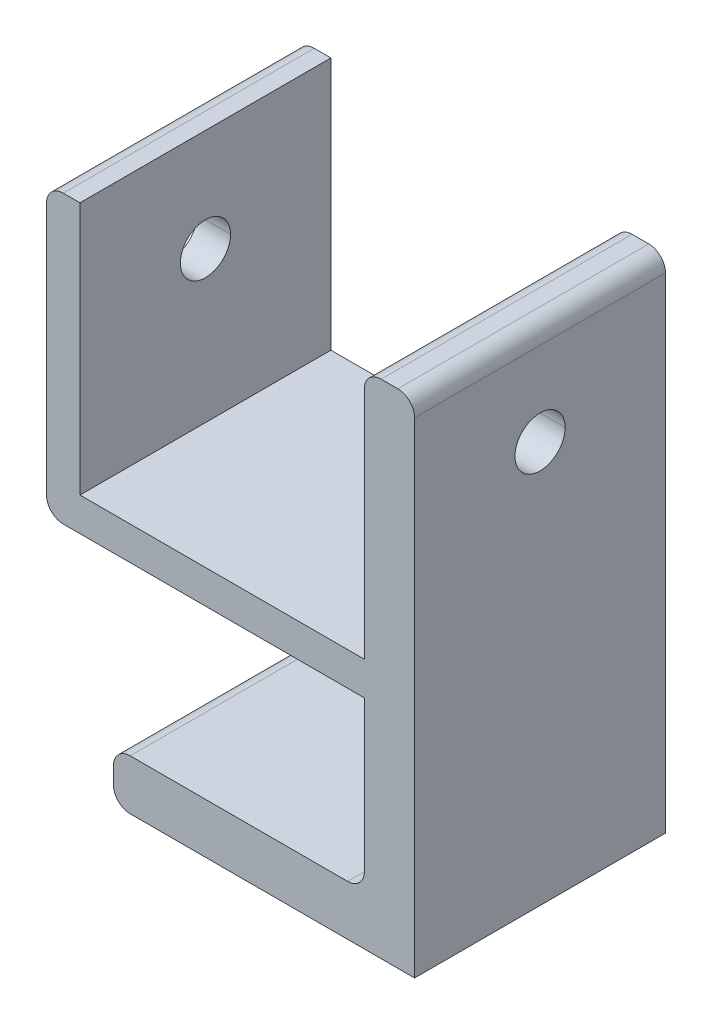
ISO-10303-21;
HEADER;
FILE_DESCRIPTION(('STEP AP214'),'2;1');
FILE_NAME('part.step','',(''),(''),'','','');
FILE_SCHEMA(('AUTOMOTIVE_DESIGN { 1 0 10303 214 1 1 1 1 }'));
ENDSEC;
DATA;
#1=APPLICATION_CONTEXT('core data for automotive mechanical design processes');
#2=APPLICATION_PROTOCOL_DEFINITION('international standard','automotive_design',2000,#1);
#3=PRODUCT_CONTEXT('',#1,'mechanical');
#4=PRODUCT('Part','Part','',(#3));
#5=PRODUCT_RELATED_PRODUCT_CATEGORY('part','',(#4));
#6=PRODUCT_DEFINITION_FORMATION('','',#4);
#7=PRODUCT_DEFINITION_CONTEXT('part definition',#1,'design');
#8=PRODUCT_DEFINITION('design','',#6,#7);
#9=PRODUCT_DEFINITION_SHAPE('','',#8);
#10=(LENGTH_UNIT() NAMED_UNIT(*) SI_UNIT(.MILLI.,.METRE.));
#11=(NAMED_UNIT(*) PLANE_ANGLE_UNIT() SI_UNIT($,.RADIAN.));
#12=(NAMED_UNIT(*) SI_UNIT($,.STERADIAN.) SOLID_ANGLE_UNIT());
#13=UNCERTAINTY_MEASURE_WITH_UNIT(LENGTH_MEASURE(1.E-05),#10,'distance_accuracy_value','');
#14=(GEOMETRIC_REPRESENTATION_CONTEXT(3) GLOBAL_UNCERTAINTY_ASSIGNED_CONTEXT((#13)) GLOBAL_UNIT_ASSIGNED_CONTEXT((#10,
#11,#12)) REPRESENTATION_CONTEXT('',''));
#15=CARTESIAN_POINT('',(0.,0.,0.));
#16=DIRECTION('',(0.,0.,1.));
#17=DIRECTION('',(1.,0.,0.));
#18=AXIS2_PLACEMENT_3D('',#15,#16,#17);
#19=CARTESIAN_POINT('',(-23.2426406871193,21.0015773299611,7.5));
#20=DIRECTION('',(1.,0.,0.));
#21=DIRECTION('',(0.,0.,-1.));
#22=AXIS2_PLACEMENT_3D('',#19,#20,#21);
#23=CYLINDRICAL_SURFACE('',#22,1.5);
#24=DIRECTION('',(1.,0.,0.));
#25=VECTOR('',#24,1.);
#26=CARTESIAN_POINT('',(-23.2426406871193,21.0015773299611,9.));
#27=LINE('',#26,#25);
#28=CARTESIAN_POINT('',(0.,21.0015773299611,9.));
#29=VERTEX_POINT('',#28);
#30=CARTESIAN_POINT('',(3.,21.0015773299611,9.));
#31=VERTEX_POINT('',#30);
#32=EDGE_CURVE('E410',#29,#31,#27,.T.);
#33=ORIENTED_EDGE('',*,*,#32,.F.);
#34=CARTESIAN_POINT('',(0.,21.0015773299611,7.5));
#35=DIRECTION('',(1.,0.,0.));
#36=DIRECTION('',(0.,1.,0.));
#37=AXIS2_PLACEMENT_3D('',#34,#35,#36);
#38=CIRCLE('',#37,1.5);
#39=CARTESIAN_POINT('',(0.,21.0015773299611,6.));
#40=VERTEX_POINT('',#39);
#41=EDGE_CURVE('E477',#40,#29,#38,.T.);
#42=ORIENTED_EDGE('',*,*,#41,.F.);
#43=DIRECTION('',(1.,0.,0.));
#44=VECTOR('',#43,1.);
#45=CARTESIAN_POINT('',(-23.2426406871193,21.0015773299611,6.));
#46=LINE('',#45,#44);
#47=CARTESIAN_POINT('',(3.,21.0015773299611,6.));
#48=VERTEX_POINT('',#47);
#49=EDGE_CURVE('E346',#40,#48,#46,.T.);
#50=ORIENTED_EDGE('',*,*,#49,.T.);
#51=CARTESIAN_POINT('',(3.,21.0015773299611,7.5));
#52=DIRECTION('',(1.,0.,0.));
#53=DIRECTION('',(0.,0.,-1.));
#54=AXIS2_PLACEMENT_3D('',#51,#52,#53);
#55=CIRCLE('',#54,1.5);
#56=EDGE_CURVE('E289',#48,#31,#55,.T.);
#57=ORIENTED_EDGE('',*,*,#56,.T.);
#58=EDGE_LOOP('',(#33,#42,#50,#57));
#59=FACE_BOUND('',#58,.T.);
#60=ADVANCED_FACE('F16',(#59),#23,.F.);
#61=CARTESIAN_POINT('',(-23.2426406871193,21.0015773299611,7.5));
#62=DIRECTION('',(1.,0.,0.));
#63=DIRECTION('',(0.,0.,-1.));
#64=AXIS2_PLACEMENT_3D('',#61,#62,#63);
#65=CYLINDRICAL_SURFACE('',#64,1.5);
#66=DIRECTION('',(1.,0.,0.));
#67=VECTOR('',#66,1.);
#68=CARTESIAN_POINT('',(-23.2426406871193,21.0015773299611,9.));
#69=LINE('',#68,#67);
#70=CARTESIAN_POINT('',(-19.,21.0015773299611,9.));
#71=VERTEX_POINT('',#70);
#72=CARTESIAN_POINT('',(-17.,21.0015773299611,9.));
#73=VERTEX_POINT('',#72);
#74=EDGE_CURVE('E330',#71,#73,#69,.T.);
#75=ORIENTED_EDGE('',*,*,#74,.F.);
#76=CARTESIAN_POINT('',(-19.,21.0015773299611,7.5));
#77=DIRECTION('',(-1.,0.,0.));
#78=DIRECTION('',(0.,0.,-1.));
#79=AXIS2_PLACEMENT_3D('',#76,#77,#78);
#80=CIRCLE('',#79,1.5);
#81=CARTESIAN_POINT('',(-19.,21.0015773299611,6.));
#82=VERTEX_POINT('',#81);
#83=EDGE_CURVE('E399',#71,#82,#80,.T.);
#84=ORIENTED_EDGE('',*,*,#83,.T.);
#85=DIRECTION('',(1.,0.,0.));
#86=VECTOR('',#85,1.);
#87=CARTESIAN_POINT('',(-23.2426406871193,21.0015773299611,6.));
#88=LINE('',#87,#86);
#89=CARTESIAN_POINT('',(-17.,21.0015773299611,6.));
#90=VERTEX_POINT('',#89);
#91=EDGE_CURVE('E329',#82,#90,#88,.T.);
#92=ORIENTED_EDGE('',*,*,#91,.T.);
#93=CARTESIAN_POINT('',(-17.,21.0015773299611,7.5));
#94=DIRECTION('',(-1.,0.,0.));
#95=DIRECTION('',(0.,0.,1.));
#96=AXIS2_PLACEMENT_3D('',#93,#94,#95);
#97=CIRCLE('',#96,1.5);
#98=EDGE_CURVE('E288',#73,#90,#97,.T.);
#99=ORIENTED_EDGE('',*,*,#98,.F.);
#100=EDGE_LOOP('',(#75,#84,#92,#99));
#101=FACE_BOUND('',#100,.T.);
#102=ADVANCED_FACE('F598',(#101),#65,.F.);
#103=CARTESIAN_POINT('',(-5.,27.1285759151948,7.5));
#104=DIRECTION('',(0.,-1.,0.));
#105=DIRECTION('',(1.,0.,0.));
#106=AXIS2_PLACEMENT_3D('',#103,#104,#105);
#107=CYLINDRICAL_SURFACE('',#106,1.5);
#108=DIRECTION('',(0.,-1.,0.));
#109=VECTOR('',#108,1.);
#110=CARTESIAN_POINT('',(-6.5,27.1285759151948,7.5));
#111=LINE('',#110,#109);
#112=CARTESIAN_POINT('',(-6.5,0.,7.5));
#113=VERTEX_POINT('',#112);
#114=CARTESIAN_POINT('',(-6.5,-3.,7.5));
#115=VERTEX_POINT('',#114);
#116=EDGE_CURVE('E340',#113,#115,#111,.T.);
#117=ORIENTED_EDGE('',*,*,#116,.F.);
#118=CARTESIAN_POINT('',(-5.,0.,7.5));
#119=DIRECTION('',(0.,1.,0.));
#120=DIRECTION('',(1.,0.,0.));
#121=AXIS2_PLACEMENT_3D('',#118,#119,#120);
#122=CIRCLE('',#121,1.5);
#123=CARTESIAN_POINT('',(-3.5,0.,7.5));
#124=VERTEX_POINT('',#123);
#125=EDGE_CURVE('E360',#113,#124,#122,.T.);
#126=ORIENTED_EDGE('',*,*,#125,.T.);
#127=DIRECTION('',(0.,-1.,0.));
#128=VECTOR('',#127,1.);
#129=CARTESIAN_POINT('',(-3.5,27.1285759151948,7.5));
#130=LINE('',#129,#128);
#131=CARTESIAN_POINT('',(-3.5,-3.,7.5));
#132=VERTEX_POINT('',#131);
#133=EDGE_CURVE('E317',#124,#132,#130,.T.);
#134=ORIENTED_EDGE('',*,*,#133,.T.);
#135=CARTESIAN_POINT('',(-5.,-3.,7.5));
#136=DIRECTION('',(0.,-1.,0.));
#137=DIRECTION('',(1.,0.,0.));
#138=AXIS2_PLACEMENT_3D('',#135,#136,#137);
#139=CIRCLE('',#138,1.5);
#140=EDGE_CURVE('E10',#132,#115,#139,.T.);
#141=ORIENTED_EDGE('',*,*,#140,.T.);
#142=EDGE_LOOP('',(#117,#126,#134,#141));
#143=FACE_BOUND('',#142,.T.);
#144=ADVANCED_FACE('F556',(#143),#107,.F.);
#145=CARTESIAN_POINT('',(2.,26.,0.));
#146=DIRECTION('',(0.,0.,1.));
#147=DIRECTION('',(1.,0.,0.));
#148=AXIS2_PLACEMENT_3D('',#145,#146,#147);
#149=PLANE('',#148);
#150=DIRECTION('',(0.,1.,0.));
#151=VECTOR('',#150,1.);
#152=CARTESIAN_POINT('',(3.,-3.,0.));
#153=LINE('',#152,#151);
#154=CARTESIAN_POINT('',(3.,-3.,0.));
#155=VERTEX_POINT('',#154);
#156=CARTESIAN_POINT('',(3.,26.,0.));
#157=VERTEX_POINT('',#156);
#158=EDGE_CURVE('E312',#155,#157,#153,.T.);
#159=ORIENTED_EDGE('',*,*,#158,.F.);
#160=DIRECTION('',(1.,0.,0.));
#161=VECTOR('',#160,1.);
#162=CARTESIAN_POINT('',(-14.,-3.,0.));
#163=LINE('',#162,#161);
#164=CARTESIAN_POINT('',(-14.,-3.,0.));
#165=VERTEX_POINT('',#164);
#166=EDGE_CURVE('E257',#165,#155,#163,.T.);
#167=ORIENTED_EDGE('',*,*,#166,.F.);
#168=CARTESIAN_POINT('',(-14.,-2.,0.));
#169=DIRECTION('',(0.,0.,1.));
#170=DIRECTION('',(-1.,0.,0.));
#171=AXIS2_PLACEMENT_3D('',#168,#169,#170);
#172=CIRCLE('',#171,1.);
#173=CARTESIAN_POINT('',(-15.,-2.,0.));
#174=VERTEX_POINT('',#173);
#175=EDGE_CURVE('E269',#174,#165,#172,.T.);
#176=ORIENTED_EDGE('',*,*,#175,.F.);
#177=DIRECTION('',(0.,-1.,0.));
#178=VECTOR('',#177,1.);
#179=CARTESIAN_POINT('',(-15.,-1.,0.));
#180=LINE('',#179,#178);
#181=CARTESIAN_POINT('',(-15.,-1.,0.));
#182=VERTEX_POINT('',#181);
#183=EDGE_CURVE('E272',#182,#174,#180,.T.);
#184=ORIENTED_EDGE('',*,*,#183,.F.);
#185=CARTESIAN_POINT('',(-14.,-1.,0.));
#186=DIRECTION('',(0.,0.,1.));
#187=DIRECTION('',(-1.,0.,0.));
#188=AXIS2_PLACEMENT_3D('',#185,#186,#187);
#189=CIRCLE('',#188,1.);
#190=CARTESIAN_POINT('',(-14.,0.,0.));
#191=VERTEX_POINT('',#190);
#192=EDGE_CURVE('E364',#191,#182,#189,.T.);
#193=ORIENTED_EDGE('',*,*,#192,.F.);
#194=DIRECTION('',(-1.,0.,0.));
#195=VECTOR('',#194,1.);
#196=CARTESIAN_POINT('',(-1.,0.,0.));
#197=LINE('',#196,#195);
#198=CARTESIAN_POINT('',(-1.,0.,0.));
#199=VERTEX_POINT('',#198);
#200=EDGE_CURVE('E339',#199,#191,#197,.T.);
#201=ORIENTED_EDGE('',*,*,#200,.F.);
#202=CARTESIAN_POINT('',(-1.,1.,0.));
#203=DIRECTION('',(0.,0.,-1.));
#204=DIRECTION('',(1.,0.,0.));
#205=AXIS2_PLACEMENT_3D('',#202,#203,#204);
#206=CIRCLE('',#205,1.);
#207=CARTESIAN_POINT('',(0.,1.,0.));
#208=VERTEX_POINT('',#207);
#209=EDGE_CURVE('E358',#208,#199,#206,.T.);
#210=ORIENTED_EDGE('',*,*,#209,.F.);
#211=DIRECTION('',(0.,-1.,0.));
#212=VECTOR('',#211,1.);
#213=CARTESIAN_POINT('',(0.,10.,0.));
#214=LINE('',#213,#212);
#215=CARTESIAN_POINT('',(0.,10.,0.));
#216=VERTEX_POINT('',#215);
#217=EDGE_CURVE('E386',#216,#208,#214,.T.);
#218=ORIENTED_EDGE('',*,*,#217,.F.);
#219=DIRECTION('',(1.,0.,0.));
#220=VECTOR('',#219,1.);
#221=CARTESIAN_POINT('',(-18.,10.,0.));
#222=LINE('',#221,#220);
#223=CARTESIAN_POINT('',(-18.,10.,0.));
#224=VERTEX_POINT('',#223);
#225=EDGE_CURVE('E401',#224,#216,#222,.T.);
#226=ORIENTED_EDGE('',*,*,#225,.F.);
#227=CARTESIAN_POINT('',(-18.,11.,0.));
#228=DIRECTION('',(0.,0.,1.));
#229=DIRECTION('',(-1.,0.,0.));
#230=AXIS2_PLACEMENT_3D('',#227,#228,#229);
#231=CIRCLE('',#230,1.);
#232=CARTESIAN_POINT('',(-19.,11.,0.));
#233=VERTEX_POINT('',#232);
#234=EDGE_CURVE('E415',#233,#224,#231,.T.);
#235=ORIENTED_EDGE('',*,*,#234,.F.);
#236=DIRECTION('',(0.,-1.,0.));
#237=VECTOR('',#236,1.);
#238=CARTESIAN_POINT('',(-19.,26.1275759151948,0.));
#239=LINE('',#238,#237);
#240=CARTESIAN_POINT('',(-19.,26.1275759151948,0.));
#241=VERTEX_POINT('',#240);
#242=EDGE_CURVE('E19',#241,#233,#239,.T.);
#243=ORIENTED_EDGE('',*,*,#242,.F.);
#244=CARTESIAN_POINT('',(-18.,26.1275759151948,0.));
#245=DIRECTION('',(0.,0.,1.));
#246=DIRECTION('',(-1.,0.,0.));
#247=AXIS2_PLACEMENT_3D('',#244,#245,#246);
#248=CIRCLE('',#247,1.);
#249=CARTESIAN_POINT('',(-18.,27.1275759151948,0.));
#250=VERTEX_POINT('',#249);
#251=EDGE_CURVE('E179',#250,#241,#248,.T.);
#252=ORIENTED_EDGE('',*,*,#251,.F.);
#253=DIRECTION('',(-1.,0.,0.));
#254=VECTOR('',#253,1.);
#255=CARTESIAN_POINT('',(-17.,27.1275759151948,0.));
#256=LINE('',#255,#254);
#257=CARTESIAN_POINT('',(-17.,27.1275759151948,0.));
#258=VERTEX_POINT('',#257);
#259=EDGE_CURVE('E283',#258,#250,#256,.T.);
#260=ORIENTED_EDGE('',*,*,#259,.F.);
#261=DIRECTION('',(0.,1.,0.));
#262=VECTOR('',#261,1.);
#263=CARTESIAN_POINT('',(-17.,12.,0.));
#264=LINE('',#263,#262);
#265=CARTESIAN_POINT('',(-17.,12.,0.));
#266=VERTEX_POINT('',#265);
#267=EDGE_CURVE('E294',#266,#258,#264,.T.);
#268=ORIENTED_EDGE('',*,*,#267,.F.);
#269=DIRECTION('',(-1.,0.,0.));
#270=VECTOR('',#269,1.);
#271=CARTESIAN_POINT('',(0.,12.,0.));
#272=LINE('',#271,#270);
#273=CARTESIAN_POINT('',(0.,12.,0.));
#274=VERTEX_POINT('',#273);
#275=EDGE_CURVE('E506',#274,#266,#272,.T.);
#276=ORIENTED_EDGE('',*,*,#275,.F.);
#277=DIRECTION('',(0.,-1.,0.));
#278=VECTOR('',#277,1.);
#279=CARTESIAN_POINT('',(0.,26.,0.));
#280=LINE('',#279,#278);
#281=CARTESIAN_POINT('',(0.,26.,0.));
#282=VERTEX_POINT('',#281);
#283=EDGE_CURVE('E304',#282,#274,#280,.T.);
#284=ORIENTED_EDGE('',*,*,#283,.F.);
#285=CARTESIAN_POINT('',(1.,26.,0.));
#286=DIRECTION('',(0.,0.,1.));
#287=DIRECTION('',(-1.,0.,0.));
#288=AXIS2_PLACEMENT_3D('',#285,#286,#287);
#289=CIRCLE('',#288,1.);
#290=CARTESIAN_POINT('',(1.,27.,0.));
#291=VERTEX_POINT('',#290);
#292=EDGE_CURVE('E432',#291,#282,#289,.T.);
#293=ORIENTED_EDGE('',*,*,#292,.F.);
#294=DIRECTION('',(-1.,0.,0.));
#295=VECTOR('',#294,1.);
#296=CARTESIAN_POINT('',(2.,27.,0.));
#297=LINE('',#296,#295);
#298=CARTESIAN_POINT('',(2.,27.,0.));
#299=VERTEX_POINT('',#298);
#300=EDGE_CURVE('E444',#299,#291,#297,.T.);
#301=ORIENTED_EDGE('',*,*,#300,.F.);
#302=CARTESIAN_POINT('',(2.,26.,0.));
#303=DIRECTION('',(0.,0.,1.));
#304=DIRECTION('',(1.,0.,0.));
#305=AXIS2_PLACEMENT_3D('',#302,#303,#304);
#306=CIRCLE('',#305,1.);
#307=EDGE_CURVE('E292',#157,#299,#306,.T.);
#308=ORIENTED_EDGE('',*,*,#307,.F.);
#309=EDGE_LOOP('',(#159,#167,#176,#184,#193,#201,#210,#218,#226,#235,#243,#252,#260,#268,#276,
#284,#293,#301,#308));
#310=FACE_BOUND('',#309,.T.);
#311=ADVANCED_FACE('F567',(#310),#149,.F.);
#312=CARTESIAN_POINT('',(2.,26.,15.));
#313=DIRECTION('',(0.,0.,1.));
#314=DIRECTION('',(1.,0.,0.));
#315=AXIS2_PLACEMENT_3D('',#312,#313,#314);
#316=PLANE('',#315);
#317=DIRECTION('',(0.,1.,0.));
#318=VECTOR('',#317,1.);
#319=CARTESIAN_POINT('',(3.,-3.,15.));
#320=LINE('',#319,#318);
#321=CARTESIAN_POINT('',(3.,-3.,15.));
#322=VERTEX_POINT('',#321);
#323=CARTESIAN_POINT('',(3.,26.,15.));
#324=VERTEX_POINT('',#323);
#325=EDGE_CURVE('E321',#322,#324,#320,.T.);
#326=ORIENTED_EDGE('',*,*,#325,.T.);
#327=CARTESIAN_POINT('',(2.,26.,15.));
#328=DIRECTION('',(0.,0.,1.));
#329=DIRECTION('',(1.,0.,0.));
#330=AXIS2_PLACEMENT_3D('',#327,#328,#329);
#331=CIRCLE('',#330,1.);
#332=CARTESIAN_POINT('',(2.,27.,15.));
#333=VERTEX_POINT('',#332);
#334=EDGE_CURVE('E382',#324,#333,#331,.T.);
#335=ORIENTED_EDGE('',*,*,#334,.T.);
#336=DIRECTION('',(-1.,0.,0.));
#337=VECTOR('',#336,1.);
#338=CARTESIAN_POINT('',(2.,27.,15.));
#339=LINE('',#338,#337);
#340=CARTESIAN_POINT('',(1.,27.,15.));
#341=VERTEX_POINT('',#340);
#342=EDGE_CURVE('E466',#333,#341,#339,.T.);
#343=ORIENTED_EDGE('',*,*,#342,.T.);
#344=CARTESIAN_POINT('',(1.,26.,15.));
#345=DIRECTION('',(0.,0.,1.));
#346=DIRECTION('',(-1.,0.,0.));
#347=AXIS2_PLACEMENT_3D('',#344,#345,#346);
#348=CIRCLE('',#347,1.);
#349=CARTESIAN_POINT('',(0.,26.,15.));
#350=VERTEX_POINT('',#349);
#351=EDGE_CURVE('E300',#341,#350,#348,.T.);
#352=ORIENTED_EDGE('',*,*,#351,.T.);
#353=DIRECTION('',(0.,-1.,0.));
#354=VECTOR('',#353,1.);
#355=CARTESIAN_POINT('',(0.,26.,15.));
#356=LINE('',#355,#354);
#357=CARTESIAN_POINT('',(0.,12.,15.));
#358=VERTEX_POINT('',#357);
#359=EDGE_CURVE('E474',#350,#358,#356,.T.);
#360=ORIENTED_EDGE('',*,*,#359,.T.);
#361=DIRECTION('',(-1.,0.,0.));
#362=VECTOR('',#361,1.);
#363=CARTESIAN_POINT('',(0.,12.,15.));
#364=LINE('',#363,#362);
#365=CARTESIAN_POINT('',(-17.,12.,15.));
#366=VERTEX_POINT('',#365);
#367=EDGE_CURVE('E299',#358,#366,#364,.T.);
#368=ORIENTED_EDGE('',*,*,#367,.T.);
#369=DIRECTION('',(0.,1.,0.));
#370=VECTOR('',#369,1.);
#371=CARTESIAN_POINT('',(-17.,12.,15.));
#372=LINE('',#371,#370);
#373=CARTESIAN_POINT('',(-17.,27.1275759151948,15.));
#374=VERTEX_POINT('',#373);
#375=EDGE_CURVE('E372',#366,#374,#372,.T.);
#376=ORIENTED_EDGE('',*,*,#375,.T.);
#377=DIRECTION('',(-1.,0.,0.));
#378=VECTOR('',#377,1.);
#379=CARTESIAN_POINT('',(-17.,27.1275759151948,15.));
#380=LINE('',#379,#378);
#381=CARTESIAN_POINT('',(-18.,27.1275759151948,15.));
#382=VERTEX_POINT('',#381);
#383=EDGE_CURVE('E331',#374,#382,#380,.T.);
#384=ORIENTED_EDGE('',*,*,#383,.T.);
#385=CARTESIAN_POINT('',(-18.,26.1275759151948,15.));
#386=DIRECTION('',(0.,0.,1.));
#387=DIRECTION('',(-1.,0.,0.));
#388=AXIS2_PLACEMENT_3D('',#385,#386,#387);
#389=CIRCLE('',#388,1.);
#390=CARTESIAN_POINT('',(-19.,26.1275759151948,15.));
#391=VERTEX_POINT('',#390);
#392=EDGE_CURVE('E192',#382,#391,#389,.T.);
#393=ORIENTED_EDGE('',*,*,#392,.T.);
#394=DIRECTION('',(0.,-1.,0.));
#395=VECTOR('',#394,1.);
#396=CARTESIAN_POINT('',(-19.,26.1275759151948,15.));
#397=LINE('',#396,#395);
#398=CARTESIAN_POINT('',(-19.,11.,15.));
#399=VERTEX_POINT('',#398);
#400=EDGE_CURVE('E395',#391,#399,#397,.T.);
#401=ORIENTED_EDGE('',*,*,#400,.T.);
#402=CARTESIAN_POINT('',(-18.,11.,15.));
#403=DIRECTION('',(0.,0.,1.));
#404=DIRECTION('',(-1.,0.,0.));
#405=AXIS2_PLACEMENT_3D('',#402,#403,#404);
#406=CIRCLE('',#405,1.);
#407=CARTESIAN_POINT('',(-18.,10.,15.));
#408=VERTEX_POINT('',#407);
#409=EDGE_CURVE('E406',#399,#408,#406,.T.);
#410=ORIENTED_EDGE('',*,*,#409,.T.);
#411=DIRECTION('',(1.,0.,0.));
#412=VECTOR('',#411,1.);
#413=CARTESIAN_POINT('',(-18.,10.,15.));
#414=LINE('',#413,#412);
#415=CARTESIAN_POINT('',(0.,10.,15.));
#416=VERTEX_POINT('',#415);
#417=EDGE_CURVE('E437',#408,#416,#414,.T.);
#418=ORIENTED_EDGE('',*,*,#417,.T.);
#419=DIRECTION('',(0.,-1.,0.));
#420=VECTOR('',#419,1.);
#421=CARTESIAN_POINT('',(0.,10.,15.));
#422=LINE('',#421,#420);
#423=CARTESIAN_POINT('',(0.,1.,15.));
#424=VERTEX_POINT('',#423);
#425=EDGE_CURVE('E354',#416,#424,#422,.T.);
#426=ORIENTED_EDGE('',*,*,#425,.T.);
#427=CARTESIAN_POINT('',(-1.,1.,15.));
#428=DIRECTION('',(0.,0.,-1.));
#429=DIRECTION('',(1.,0.,0.));
#430=AXIS2_PLACEMENT_3D('',#427,#428,#429);
#431=CIRCLE('',#430,1.);
#432=CARTESIAN_POINT('',(-1.,0.,15.));
#433=VERTEX_POINT('',#432);
#434=EDGE_CURVE('E527',#424,#433,#431,.T.);
#435=ORIENTED_EDGE('',*,*,#434,.T.);
#436=DIRECTION('',(-1.,0.,0.));
#437=VECTOR('',#436,1.);
#438=CARTESIAN_POINT('',(-1.,0.,15.));
#439=LINE('',#438,#437);
#440=CARTESIAN_POINT('',(-14.,0.,15.));
#441=VERTEX_POINT('',#440);
#442=EDGE_CURVE('E338',#433,#441,#439,.T.);
#443=ORIENTED_EDGE('',*,*,#442,.T.);
#444=CARTESIAN_POINT('',(-14.,-1.,15.));
#445=DIRECTION('',(0.,0.,1.));
#446=DIRECTION('',(-1.,0.,0.));
#447=AXIS2_PLACEMENT_3D('',#444,#445,#446);
#448=CIRCLE('',#447,1.);
#449=CARTESIAN_POINT('',(-15.,-1.,15.));
#450=VERTEX_POINT('',#449);
#451=EDGE_CURVE('E264',#441,#450,#448,.T.);
#452=ORIENTED_EDGE('',*,*,#451,.T.);
#453=DIRECTION('',(0.,-1.,0.));
#454=VECTOR('',#453,1.);
#455=CARTESIAN_POINT('',(-15.,-1.,15.));
#456=LINE('',#455,#454);
#457=CARTESIAN_POINT('',(-15.,-2.,15.));
#458=VERTEX_POINT('',#457);
#459=EDGE_CURVE('E260',#450,#458,#456,.T.);
#460=ORIENTED_EDGE('',*,*,#459,.T.);
#461=CARTESIAN_POINT('',(-14.,-2.,15.));
#462=DIRECTION('',(0.,0.,1.));
#463=DIRECTION('',(-1.,0.,0.));
#464=AXIS2_PLACEMENT_3D('',#461,#462,#463);
#465=CIRCLE('',#464,1.);
#466=CARTESIAN_POINT('',(-14.,-3.,15.));
#467=VERTEX_POINT('',#466);
#468=EDGE_CURVE('E247',#458,#467,#465,.T.);
#469=ORIENTED_EDGE('',*,*,#468,.T.);
#470=DIRECTION('',(1.,0.,0.));
#471=VECTOR('',#470,1.);
#472=CARTESIAN_POINT('',(-14.,-3.,15.));
#473=LINE('',#472,#471);
#474=EDGE_CURVE('E26',#467,#322,#473,.T.);
#475=ORIENTED_EDGE('',*,*,#474,.T.);
#476=EDGE_LOOP('',(#326,#335,#343,#352,#360,#368,#376,#384,#393,#401,#410,#418,#426,#435,#443,
#452,#460,#469,#475));
#477=FACE_BOUND('',#476,.T.);
#478=ADVANCED_FACE('F262',(#477),#316,.T.);
#479=CARTESIAN_POINT('',(-14.,-3.,15.));
#480=DIRECTION('',(0.,1.,0.));
#481=DIRECTION('',(1.,0.,0.));
#482=AXIS2_PLACEMENT_3D('',#479,#480,#481);
#483=PLANE('',#482);
#484=ORIENTED_EDGE('',*,*,#140,.F.);
#485=CARTESIAN_POINT('',(-5.,-3.,7.5));
#486=DIRECTION('',(0.,-1.,0.));
#487=DIRECTION('',(1.,0.,0.));
#488=AXIS2_PLACEMENT_3D('',#485,#486,#487);
#489=CIRCLE('',#488,1.5);
#490=EDGE_CURVE('E344',#115,#132,#489,.T.);
#491=ORIENTED_EDGE('',*,*,#490,.F.);
#492=EDGE_LOOP('',(#484,#491));
#493=FACE_BOUND('',#492,.T.);
#494=ORIENTED_EDGE('',*,*,#166,.T.);
#495=DIRECTION('',(0.,0.,-1.));
#496=VECTOR('',#495,1.);
#497=CARTESIAN_POINT('',(3.,-3.,15.));
#498=LINE('',#497,#496);
#499=EDGE_CURVE('E293',#322,#155,#498,.T.);
#500=ORIENTED_EDGE('',*,*,#499,.F.);
#501=ORIENTED_EDGE('',*,*,#474,.F.);
#502=DIRECTION('',(0.,0.,-1.));
#503=VECTOR('',#502,1.);
#504=CARTESIAN_POINT('',(-14.,-3.,15.));
#505=LINE('',#504,#503);
#506=EDGE_CURVE('E254',#467,#165,#505,.T.);
#507=ORIENTED_EDGE('',*,*,#506,.T.);
#508=EDGE_LOOP('',(#494,#500,#501,#507));
#509=FACE_BOUND('',#508,.T.);
#510=ADVANCED_FACE('F559',(#493,#509),#483,.F.);
#511=CARTESIAN_POINT('',(-14.,-2.,15.));
#512=DIRECTION('',(0.,0.,-1.));
#513=DIRECTION('',(-1.,0.,0.));
#514=AXIS2_PLACEMENT_3D('',#511,#512,#513);
#515=CYLINDRICAL_SURFACE('',#514,1.);
#516=ORIENTED_EDGE('',*,*,#175,.T.);
#517=ORIENTED_EDGE('',*,*,#506,.F.);
#518=ORIENTED_EDGE('',*,*,#468,.F.);
#519=DIRECTION('',(0.,0.,-1.));
#520=VECTOR('',#519,1.);
#521=CARTESIAN_POINT('',(-15.,-2.,15.));
#522=LINE('',#521,#520);
#523=EDGE_CURVE('E252',#458,#174,#522,.T.);
#524=ORIENTED_EDGE('',*,*,#523,.T.);
#525=EDGE_LOOP('',(#516,#517,#518,#524));
#526=FACE_BOUND('',#525,.T.);
#527=ADVANCED_FACE('F250',(#526),#515,.T.);
#528=CARTESIAN_POINT('',(-15.,-1.,15.));
#529=DIRECTION('',(1.,0.,0.));
#530=DIRECTION('',(0.,1.,0.));
#531=AXIS2_PLACEMENT_3D('',#528,#529,#530);
#532=PLANE('',#531);
#533=ORIENTED_EDGE('',*,*,#183,.T.);
#534=ORIENTED_EDGE('',*,*,#523,.F.);
#535=ORIENTED_EDGE('',*,*,#459,.F.);
#536=DIRECTION('',(0.,0.,-1.));
#537=VECTOR('',#536,1.);
#538=CARTESIAN_POINT('',(-15.,-1.,15.));
#539=LINE('',#538,#537);
#540=EDGE_CURVE('E368',#450,#182,#539,.T.);
#541=ORIENTED_EDGE('',*,*,#540,.T.);
#542=EDGE_LOOP('',(#533,#534,#535,#541));
#543=FACE_BOUND('',#542,.T.);
#544=ADVANCED_FACE('F271',(#543),#532,.F.);
#545=CARTESIAN_POINT('',(-14.,-1.,15.));
#546=DIRECTION('',(0.,0.,-1.));
#547=DIRECTION('',(-1.,0.,0.));
#548=AXIS2_PLACEMENT_3D('',#545,#546,#547);
#549=CYLINDRICAL_SURFACE('',#548,1.);
#550=ORIENTED_EDGE('',*,*,#192,.T.);
#551=ORIENTED_EDGE('',*,*,#540,.F.);
#552=ORIENTED_EDGE('',*,*,#451,.F.);
#553=DIRECTION('',(0.,0.,-1.));
#554=VECTOR('',#553,1.);
#555=CARTESIAN_POINT('',(-14.,0.,15.));
#556=LINE('',#555,#554);
#557=EDGE_CURVE('E334',#441,#191,#556,.T.);
#558=ORIENTED_EDGE('',*,*,#557,.T.);
#559=EDGE_LOOP('',(#550,#551,#552,#558));
#560=FACE_BOUND('',#559,.T.);
#561=ADVANCED_FACE('F646',(#560),#549,.T.);
#562=CARTESIAN_POINT('',(-1.,0.,15.));
#563=DIRECTION('',(0.,-1.,0.));
#564=DIRECTION('',(0.,0.,-1.));
#565=AXIS2_PLACEMENT_3D('',#562,#563,#564);
#566=PLANE('',#565);
#567=CARTESIAN_POINT('',(-5.,0.,7.5));
#568=DIRECTION('',(0.,1.,0.));
#569=DIRECTION('',(1.,0.,0.));
#570=AXIS2_PLACEMENT_3D('',#567,#568,#569);
#571=CIRCLE('',#570,1.5);
#572=EDGE_CURVE('E345',#124,#113,#571,.T.);
#573=ORIENTED_EDGE('',*,*,#572,.F.);
#574=ORIENTED_EDGE('',*,*,#125,.F.);
#575=EDGE_LOOP('',(#573,#574));
#576=FACE_BOUND('',#575,.T.);
#577=ORIENTED_EDGE('',*,*,#200,.T.);
#578=ORIENTED_EDGE('',*,*,#557,.F.);
#579=ORIENTED_EDGE('',*,*,#442,.F.);
#580=DIRECTION('',(0.,0.,-1.));
#581=VECTOR('',#580,1.);
#582=CARTESIAN_POINT('',(-1.,0.,15.));
#583=LINE('',#582,#581);
#584=EDGE_CURVE('E419',#433,#199,#583,.T.);
#585=ORIENTED_EDGE('',*,*,#584,.T.);
#586=EDGE_LOOP('',(#577,#578,#579,#585));
#587=FACE_BOUND('',#586,.T.);
#588=ADVANCED_FACE('F551',(#576,#587),#566,.F.);
#589=CARTESIAN_POINT('',(-1.,1.,15.));
#590=DIRECTION('',(0.,0.,-1.));
#591=DIRECTION('',(-1.,0.,0.));
#592=AXIS2_PLACEMENT_3D('',#589,#590,#591);
#593=CYLINDRICAL_SURFACE('',#592,1.);
#594=ORIENTED_EDGE('',*,*,#209,.T.);
#595=ORIENTED_EDGE('',*,*,#584,.F.);
#596=ORIENTED_EDGE('',*,*,#434,.F.);
#597=DIRECTION('',(0.,0.,-1.));
#598=VECTOR('',#597,1.);
#599=CARTESIAN_POINT('',(0.,1.,15.));
#600=LINE('',#599,#598);
#601=EDGE_CURVE('E359',#424,#208,#600,.T.);
#602=ORIENTED_EDGE('',*,*,#601,.T.);
#603=EDGE_LOOP('',(#594,#595,#596,#602));
#604=FACE_BOUND('',#603,.T.);
#605=ADVANCED_FACE('F636',(#604),#593,.F.);
#606=CARTESIAN_POINT('',(0.,10.,15.));
#607=DIRECTION('',(1.,0.,0.));
#608=DIRECTION('',(0.,-1.,0.));
#609=AXIS2_PLACEMENT_3D('',#606,#607,#608);
#610=PLANE('',#609);
#611=ORIENTED_EDGE('',*,*,#217,.T.);
#612=ORIENTED_EDGE('',*,*,#601,.F.);
#613=ORIENTED_EDGE('',*,*,#425,.F.);
#614=DIRECTION('',(0.,0.,-1.));
#615=VECTOR('',#614,1.);
#616=CARTESIAN_POINT('',(0.,10.,15.));
#617=LINE('',#616,#615);
#618=EDGE_CURVE('E405',#416,#216,#617,.T.);
#619=ORIENTED_EDGE('',*,*,#618,.T.);
#620=EDGE_LOOP('',(#611,#612,#613,#619));
#621=FACE_BOUND('',#620,.T.);
#622=ADVANCED_FACE('F639',(#621),#610,.F.);
#623=CARTESIAN_POINT('',(-18.,10.,15.));
#624=DIRECTION('',(0.,1.,0.));
#625=DIRECTION('',(1.,0.,0.));
#626=AXIS2_PLACEMENT_3D('',#623,#624,#625);
#627=PLANE('',#626);
#628=ORIENTED_EDGE('',*,*,#225,.T.);
#629=ORIENTED_EDGE('',*,*,#618,.F.);
#630=ORIENTED_EDGE('',*,*,#417,.F.);
#631=DIRECTION('',(0.,0.,-1.));
#632=VECTOR('',#631,1.);
#633=CARTESIAN_POINT('',(-18.,10.,15.));
#634=LINE('',#633,#632);
#635=EDGE_CURVE('E427',#408,#224,#634,.T.);
#636=ORIENTED_EDGE('',*,*,#635,.T.);
#637=EDGE_LOOP('',(#628,#629,#630,#636));
#638=FACE_BOUND('',#637,.T.);
#639=ADVANCED_FACE('F652',(#638),#627,.F.);
#640=CARTESIAN_POINT('',(-18.,11.,15.));
#641=DIRECTION('',(0.,0.,-1.));
#642=DIRECTION('',(-1.,0.,0.));
#643=AXIS2_PLACEMENT_3D('',#640,#641,#642);
#644=CYLINDRICAL_SURFACE('',#643,1.);
#645=ORIENTED_EDGE('',*,*,#234,.T.);
#646=ORIENTED_EDGE('',*,*,#635,.F.);
#647=ORIENTED_EDGE('',*,*,#409,.F.);
#648=DIRECTION('',(0.,0.,-1.));
#649=VECTOR('',#648,1.);
#650=CARTESIAN_POINT('',(-19.,11.,15.));
#651=LINE('',#650,#649);
#652=EDGE_CURVE('E400',#399,#233,#651,.T.);
#653=ORIENTED_EDGE('',*,*,#652,.T.);
#654=EDGE_LOOP('',(#645,#646,#647,#653));
#655=FACE_BOUND('',#654,.T.);
#656=ADVANCED_FACE('F633',(#655),#644,.T.);
#657=CARTESIAN_POINT('',(-19.,26.1275759151948,15.));
#658=DIRECTION('',(1.,0.,0.));
#659=DIRECTION('',(0.,1.,0.));
#660=AXIS2_PLACEMENT_3D('',#657,#658,#659);
#661=PLANE('',#660);
#662=CARTESIAN_POINT('',(-19.,21.0015773299611,7.5));
#663=DIRECTION('',(-1.,0.,0.));
#664=DIRECTION('',(0.,0.,-1.));
#665=AXIS2_PLACEMENT_3D('',#662,#663,#664);
#666=CIRCLE('',#665,1.5);
#667=EDGE_CURVE('E350',#82,#71,#666,.T.);
#668=ORIENTED_EDGE('',*,*,#667,.F.);
#669=ORIENTED_EDGE('',*,*,#83,.F.);
#670=EDGE_LOOP('',(#668,#669));
#671=FACE_BOUND('',#670,.T.);
#672=ORIENTED_EDGE('',*,*,#242,.T.);
#673=ORIENTED_EDGE('',*,*,#652,.F.);
#674=ORIENTED_EDGE('',*,*,#400,.F.);
#675=DIRECTION('',(0.,0.,-1.));
#676=VECTOR('',#675,1.);
#677=CARTESIAN_POINT('',(-19.,26.1275759151948,15.));
#678=LINE('',#677,#676);
#679=EDGE_CURVE('E375',#391,#241,#678,.T.);
#680=ORIENTED_EDGE('',*,*,#679,.T.);
#681=EDGE_LOOP('',(#672,#673,#674,#680));
#682=FACE_BOUND('',#681,.T.);
#683=ADVANCED_FACE('F631',(#671,#682),#661,.F.);
#684=CARTESIAN_POINT('',(-18.,26.1275759151948,15.));
#685=DIRECTION('',(0.,0.,-1.));
#686=DIRECTION('',(-1.,0.,0.));
#687=AXIS2_PLACEMENT_3D('',#684,#685,#686);
#688=CYLINDRICAL_SURFACE('',#687,1.);
#689=ORIENTED_EDGE('',*,*,#251,.T.);
#690=ORIENTED_EDGE('',*,*,#679,.F.);
#691=ORIENTED_EDGE('',*,*,#392,.F.);
#692=DIRECTION('',(0.,0.,-1.));
#693=VECTOR('',#692,1.);
#694=CARTESIAN_POINT('',(-18.,27.1275759151948,15.));
#695=LINE('',#694,#693);
#696=EDGE_CURVE('E287',#382,#250,#695,.T.);
#697=ORIENTED_EDGE('',*,*,#696,.T.);
#698=EDGE_LOOP('',(#689,#690,#691,#697));
#699=FACE_BOUND('',#698,.T.);
#700=ADVANCED_FACE('F622',(#699),#688,.T.);
#701=CARTESIAN_POINT('',(-17.,27.1275759151948,15.));
#702=DIRECTION('',(0.,-1.,0.));
#703=DIRECTION('',(0.,0.,-1.));
#704=AXIS2_PLACEMENT_3D('',#701,#702,#703);
#705=PLANE('',#704);
#706=ORIENTED_EDGE('',*,*,#259,.T.);
#707=ORIENTED_EDGE('',*,*,#696,.F.);
#708=ORIENTED_EDGE('',*,*,#383,.F.);
#709=DIRECTION('',(0.,0.,-1.));
#710=VECTOR('',#709,1.);
#711=CARTESIAN_POINT('',(-17.,27.1275759151948,15.));
#712=LINE('',#711,#710);
#713=EDGE_CURVE('E298',#374,#258,#712,.T.);
#714=ORIENTED_EDGE('',*,*,#713,.T.);
#715=EDGE_LOOP('',(#706,#707,#708,#714));
#716=FACE_BOUND('',#715,.T.);
#717=ADVANCED_FACE('F592',(#716),#705,.F.);
#718=CARTESIAN_POINT('',(-17.,12.,15.));
#719=DIRECTION('',(-1.,0.,0.));
#720=DIRECTION('',(0.,0.,1.));
#721=AXIS2_PLACEMENT_3D('',#718,#719,#720);
#722=PLANE('',#721);
#723=CARTESIAN_POINT('',(-17.,21.0015773299611,7.5));
#724=DIRECTION('',(-1.,0.,0.));
#725=DIRECTION('',(0.,0.,1.));
#726=AXIS2_PLACEMENT_3D('',#723,#724,#725);
#727=CIRCLE('',#726,1.5);
#728=EDGE_CURVE('E325',#90,#73,#727,.T.);
#729=ORIENTED_EDGE('',*,*,#728,.T.);
#730=ORIENTED_EDGE('',*,*,#98,.T.);
#731=EDGE_LOOP('',(#729,#730));
#732=FACE_BOUND('',#731,.T.);
#733=ORIENTED_EDGE('',*,*,#267,.T.);
#734=ORIENTED_EDGE('',*,*,#713,.F.);
#735=ORIENTED_EDGE('',*,*,#375,.F.);
#736=DIRECTION('',(0.,0.,-1.));
#737=VECTOR('',#736,1.);
#738=CARTESIAN_POINT('',(-17.,12.,15.));
#739=LINE('',#738,#737);
#740=EDGE_CURVE('E450',#366,#266,#739,.T.);
#741=ORIENTED_EDGE('',*,*,#740,.T.);
#742=EDGE_LOOP('',(#733,#734,#735,#741));
#743=FACE_BOUND('',#742,.T.);
#744=ADVANCED_FACE('F583',(#732,#743),#722,.F.);
#745=CARTESIAN_POINT('',(0.,12.,15.));
#746=DIRECTION('',(0.,-1.,0.));
#747=DIRECTION('',(0.,0.,-1.));
#748=AXIS2_PLACEMENT_3D('',#745,#746,#747);
#749=PLANE('',#748);
#750=ORIENTED_EDGE('',*,*,#275,.T.);
#751=ORIENTED_EDGE('',*,*,#740,.F.);
#752=ORIENTED_EDGE('',*,*,#367,.F.);
#753=DIRECTION('',(0.,0.,-1.));
#754=VECTOR('',#753,1.);
#755=CARTESIAN_POINT('',(0.,12.,15.));
#756=LINE('',#755,#754);
#757=EDGE_CURVE('E309',#358,#274,#756,.T.);
#758=ORIENTED_EDGE('',*,*,#757,.T.);
#759=EDGE_LOOP('',(#750,#751,#752,#758));
#760=FACE_BOUND('',#759,.T.);
#761=ADVANCED_FACE('F581',(#760),#749,.F.);
#762=CARTESIAN_POINT('',(0.,26.,15.));
#763=DIRECTION('',(1.,0.,0.));
#764=DIRECTION('',(0.,1.,0.));
#765=AXIS2_PLACEMENT_3D('',#762,#763,#764);
#766=PLANE('',#765);
#767=ORIENTED_EDGE('',*,*,#41,.T.);
#768=CARTESIAN_POINT('',(0.,21.0015773299611,7.5));
#769=DIRECTION('',(1.,0.,0.));
#770=DIRECTION('',(0.,1.,0.));
#771=AXIS2_PLACEMENT_3D('',#768,#769,#770);
#772=CIRCLE('',#771,1.5);
#773=EDGE_CURVE('E436',#29,#40,#772,.T.);
#774=ORIENTED_EDGE('',*,*,#773,.T.);
#775=EDGE_LOOP('',(#767,#774));
#776=FACE_BOUND('',#775,.T.);
#777=ORIENTED_EDGE('',*,*,#283,.T.);
#778=ORIENTED_EDGE('',*,*,#757,.F.);
#779=ORIENTED_EDGE('',*,*,#359,.F.);
#780=DIRECTION('',(0.,0.,-1.));
#781=VECTOR('',#780,1.);
#782=CARTESIAN_POINT('',(0.,26.,15.));
#783=LINE('',#782,#781);
#784=EDGE_CURVE('E305',#350,#282,#783,.T.);
#785=ORIENTED_EDGE('',*,*,#784,.T.);
#786=EDGE_LOOP('',(#777,#778,#779,#785));
#787=FACE_BOUND('',#786,.T.);
#788=ADVANCED_FACE('F578',(#776,#787),#766,.F.);
#789=CARTESIAN_POINT('',(1.,26.,15.));
#790=DIRECTION('',(0.,0.,-1.));
#791=DIRECTION('',(-1.,0.,0.));
#792=AXIS2_PLACEMENT_3D('',#789,#790,#791);
#793=CYLINDRICAL_SURFACE('',#792,1.);
#794=ORIENTED_EDGE('',*,*,#292,.T.);
#795=ORIENTED_EDGE('',*,*,#784,.F.);
#796=ORIENTED_EDGE('',*,*,#351,.F.);
#797=DIRECTION('',(0.,0.,-1.));
#798=VECTOR('',#797,1.);
#799=CARTESIAN_POINT('',(1.,27.,15.));
#800=LINE('',#799,#798);
#801=EDGE_CURVE('E470',#341,#291,#800,.T.);
#802=ORIENTED_EDGE('',*,*,#801,.T.);
#803=EDGE_LOOP('',(#794,#795,#796,#802));
#804=FACE_BOUND('',#803,.T.);
#805=ADVANCED_FACE('F576',(#804),#793,.T.);
#806=CARTESIAN_POINT('',(2.,27.,15.));
#807=DIRECTION('',(0.,-1.,0.));
#808=DIRECTION('',(0.,0.,-1.));
#809=AXIS2_PLACEMENT_3D('',#806,#807,#808);
#810=PLANE('',#809);
#811=ORIENTED_EDGE('',*,*,#300,.T.);
#812=ORIENTED_EDGE('',*,*,#801,.F.);
#813=ORIENTED_EDGE('',*,*,#342,.F.);
#814=DIRECTION('',(0.,0.,-1.));
#815=VECTOR('',#814,1.);
#816=CARTESIAN_POINT('',(2.,27.,15.));
#817=LINE('',#816,#815);
#818=EDGE_CURVE('E378',#333,#299,#817,.T.);
#819=ORIENTED_EDGE('',*,*,#818,.T.);
#820=EDGE_LOOP('',(#811,#812,#813,#819));
#821=FACE_BOUND('',#820,.T.);
#822=ADVANCED_FACE('F574',(#821),#810,.F.);
#823=CARTESIAN_POINT('',(2.,26.,15.));
#824=DIRECTION('',(0.,0.,-1.));
#825=DIRECTION('',(-1.,0.,0.));
#826=AXIS2_PLACEMENT_3D('',#823,#824,#825);
#827=CYLINDRICAL_SURFACE('',#826,1.);
#828=ORIENTED_EDGE('',*,*,#307,.T.);
#829=ORIENTED_EDGE('',*,*,#818,.F.);
#830=ORIENTED_EDGE('',*,*,#334,.F.);
#831=DIRECTION('',(0.,0.,-1.));
#832=VECTOR('',#831,1.);
#833=CARTESIAN_POINT('',(3.,26.,15.));
#834=LINE('',#833,#832);
#835=EDGE_CURVE('E316',#324,#157,#834,.T.);
#836=ORIENTED_EDGE('',*,*,#835,.T.);
#837=EDGE_LOOP('',(#828,#829,#830,#836));
#838=FACE_BOUND('',#837,.T.);
#839=ADVANCED_FACE('F570',(#838),#827,.T.);
#840=CARTESIAN_POINT('',(3.,-3.,15.));
#841=DIRECTION('',(-1.,0.,0.));
#842=DIRECTION('',(0.,0.,1.));
#843=AXIS2_PLACEMENT_3D('',#840,#841,#842);
#844=PLANE('',#843);
#845=ORIENTED_EDGE('',*,*,#56,.F.);
#846=CARTESIAN_POINT('',(3.,21.0015773299611,7.5));
#847=DIRECTION('',(1.,0.,0.));
#848=DIRECTION('',(0.,0.,-1.));
#849=AXIS2_PLACEMENT_3D('',#846,#847,#848);
#850=CIRCLE('',#849,1.5);
#851=EDGE_CURVE('E351',#31,#48,#850,.T.);
#852=ORIENTED_EDGE('',*,*,#851,.F.);
#853=EDGE_LOOP('',(#845,#852));
#854=FACE_BOUND('',#853,.T.);
#855=ORIENTED_EDGE('',*,*,#158,.T.);
#856=ORIENTED_EDGE('',*,*,#835,.F.);
#857=ORIENTED_EDGE('',*,*,#325,.F.);
#858=ORIENTED_EDGE('',*,*,#499,.T.);
#859=EDGE_LOOP('',(#855,#856,#857,#858));
#860=FACE_BOUND('',#859,.T.);
#861=ADVANCED_FACE('F565',(#854,#860),#844,.F.);
#862=CARTESIAN_POINT('',(-5.,27.1285759151948,7.5));
#863=DIRECTION('',(0.,-1.,0.));
#864=DIRECTION('',(1.,0.,0.));
#865=AXIS2_PLACEMENT_3D('',#862,#863,#864);
#866=CYLINDRICAL_SURFACE('',#865,1.5);
#867=ORIENTED_EDGE('',*,*,#572,.T.);
#868=ORIENTED_EDGE('',*,*,#116,.T.);
#869=ORIENTED_EDGE('',*,*,#490,.T.);
#870=ORIENTED_EDGE('',*,*,#133,.F.);
#871=EDGE_LOOP('',(#867,#868,#869,#870));
#872=FACE_BOUND('',#871,.T.);
#873=ADVANCED_FACE('F548',(#872),#866,.F.);
#874=CARTESIAN_POINT('',(-23.2426406871193,21.0015773299611,7.5));
#875=DIRECTION('',(1.,0.,0.));
#876=DIRECTION('',(0.,0.,-1.));
#877=AXIS2_PLACEMENT_3D('',#874,#875,#876);
#878=CYLINDRICAL_SURFACE('',#877,1.5);
#879=ORIENTED_EDGE('',*,*,#667,.T.);
#880=ORIENTED_EDGE('',*,*,#74,.T.);
#881=ORIENTED_EDGE('',*,*,#728,.F.);
#882=ORIENTED_EDGE('',*,*,#91,.F.);
#883=EDGE_LOOP('',(#879,#880,#881,#882));
#884=FACE_BOUND('',#883,.T.);
#885=ADVANCED_FACE('F618',(#884),#878,.F.);
#886=CARTESIAN_POINT('',(-23.2426406871193,21.0015773299611,7.5));
#887=DIRECTION('',(1.,0.,0.));
#888=DIRECTION('',(0.,0.,-1.));
#889=AXIS2_PLACEMENT_3D('',#886,#887,#888);
#890=CYLINDRICAL_SURFACE('',#889,1.5);
#891=ORIENTED_EDGE('',*,*,#773,.F.);
#892=ORIENTED_EDGE('',*,*,#32,.T.);
#893=ORIENTED_EDGE('',*,*,#851,.T.);
#894=ORIENTED_EDGE('',*,*,#49,.F.);
#895=EDGE_LOOP('',(#891,#892,#893,#894));
#896=FACE_BOUND('',#895,.T.);
#897=ADVANCED_FACE('F610',(#896),#890,.F.);
#898=CLOSED_SHELL('',(#60,#102,#144,#311,#478,#510,#527,#544,#561,#588,#605,#622,#639,#656,#683,
#700,#717,#744,#761,#788,#805,#822,#839,#861,#873,#885,#897));
#899=MANIFOLD_SOLID_BREP('B1',#898);
#900=ADVANCED_BREP_SHAPE_REPRESENTATION('',(#18,#899),#14);
#901=SHAPE_DEFINITION_REPRESENTATION(#9,#900);
ENDSEC;
END-ISO-10303-21;
